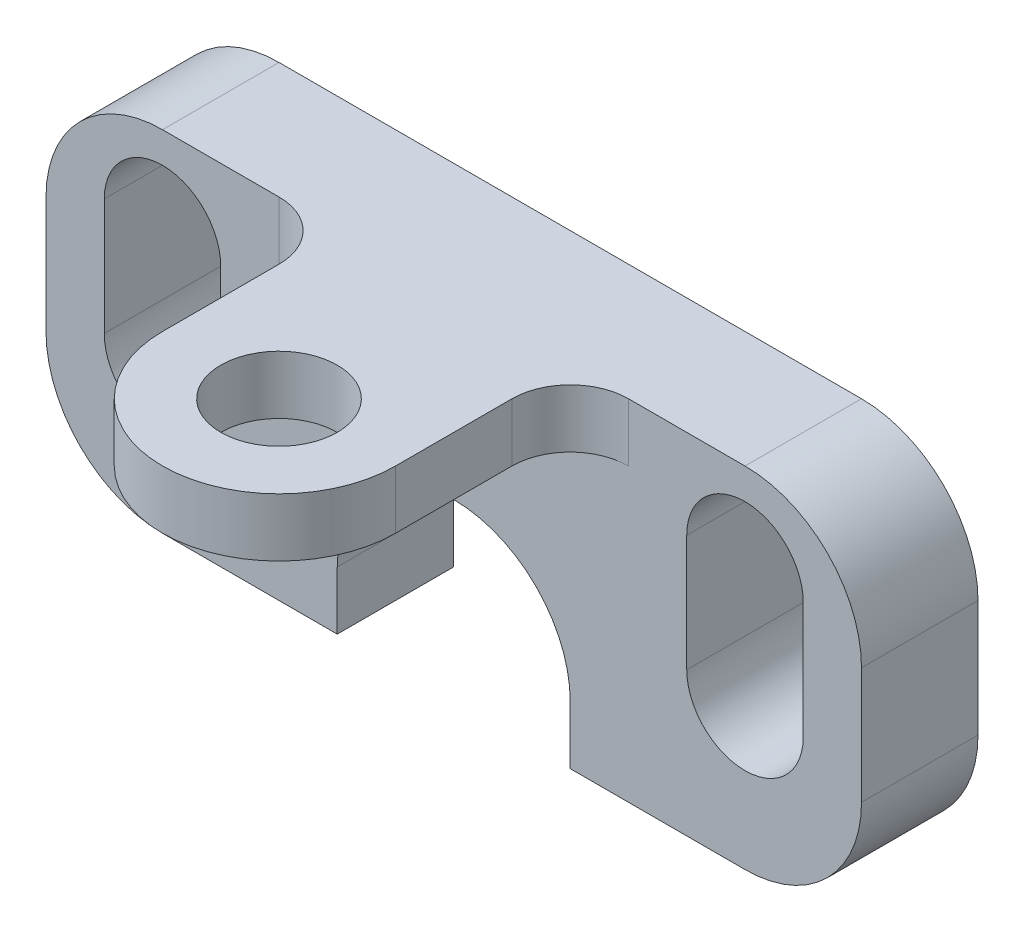
ISO-10303-21;
HEADER;
FILE_DESCRIPTION(('STEP AP214'),'2;1');
FILE_NAME('part.step','',(''),(''),'','','');
FILE_SCHEMA(('AUTOMOTIVE_DESIGN { 1 0 10303 214 1 1 1 1 }'));
ENDSEC;
DATA;
#1=APPLICATION_CONTEXT('core data for automotive mechanical design processes');
#2=APPLICATION_PROTOCOL_DEFINITION('international standard','automotive_design',2000,#1);
#3=PRODUCT_CONTEXT('',#1,'mechanical');
#4=PRODUCT('Part','Part','',(#3));
#5=PRODUCT_RELATED_PRODUCT_CATEGORY('part','',(#4));
#6=PRODUCT_DEFINITION_FORMATION('','',#4);
#7=PRODUCT_DEFINITION_CONTEXT('part definition',#1,'design');
#8=PRODUCT_DEFINITION('design','',#6,#7);
#9=PRODUCT_DEFINITION_SHAPE('','',#8);
#10=(LENGTH_UNIT() NAMED_UNIT(*) SI_UNIT(.MILLI.,.METRE.));
#11=(NAMED_UNIT(*) PLANE_ANGLE_UNIT() SI_UNIT($,.RADIAN.));
#12=(NAMED_UNIT(*) SI_UNIT($,.STERADIAN.) SOLID_ANGLE_UNIT());
#13=UNCERTAINTY_MEASURE_WITH_UNIT(LENGTH_MEASURE(1.E-05),#10,'distance_accuracy_value','');
#14=(GEOMETRIC_REPRESENTATION_CONTEXT(3) GLOBAL_UNCERTAINTY_ASSIGNED_CONTEXT((#13)) GLOBAL_UNIT_ASSIGNED_CONTEXT((#10,
#11,#12)) REPRESENTATION_CONTEXT('',''));
#15=CARTESIAN_POINT('',(0.,0.,0.));
#16=DIRECTION('',(0.,0.,1.));
#17=DIRECTION('',(1.,0.,0.));
#18=AXIS2_PLACEMENT_3D('',#15,#16,#17);
#19=CARTESIAN_POINT('',(0.,-10.,10.));
#20=DIRECTION('',(0.,0.,1.));
#21=DIRECTION('',(1.,0.,0.));
#22=AXIS2_PLACEMENT_3D('',#19,#20,#21);
#23=PLANE('',#22);
#24=DIRECTION('',(-1.,0.,0.));
#25=VECTOR('',#24,1.);
#26=CARTESIAN_POINT('',(-24.9999999999999,15.,10.));
#27=LINE('',#26,#25);
#28=CARTESIAN_POINT('',(24.9999999999999,15.,10.));
#29=VERTEX_POINT('',#28);
#30=CARTESIAN_POINT('',(14.9999999999999,15.,10.));
#31=VERTEX_POINT('',#30);
#32=EDGE_CURVE('E328',#29,#31,#27,.T.);
#33=ORIENTED_EDGE('',*,*,#32,.T.);
#34=DIRECTION('',(0.,1.,0.));
#35=VECTOR('',#34,1.);
#36=CARTESIAN_POINT('',(14.9999999999999,-10.,10.));
#37=LINE('',#36,#35);
#38=CARTESIAN_POINT('',(14.9999999999999,10.,10.));
#39=VERTEX_POINT('',#38);
#40=EDGE_CURVE('E405',#31,#39,#37,.F.);
#41=ORIENTED_EDGE('',*,*,#40,.T.);
#42=DIRECTION('',(1.,0.,0.));
#43=VECTOR('',#42,1.);
#44=CARTESIAN_POINT('',(9.99999999999993,10.,10.));
#45=LINE('',#44,#43);
#46=CARTESIAN_POINT('',(-15.0000000000001,10.,10.));
#47=VERTEX_POINT('',#46);
#48=EDGE_CURVE('E47',#47,#39,#45,.T.);
#49=ORIENTED_EDGE('',*,*,#48,.F.);
#50=DIRECTION('',(0.,-1.,0.));
#51=VECTOR('',#50,1.);
#52=CARTESIAN_POINT('',(-15.0000000000001,-10.,10.));
#53=LINE('',#52,#51);
#54=CARTESIAN_POINT('',(-15.0000000000001,15.,10.));
#55=VERTEX_POINT('',#54);
#56=EDGE_CURVE('E397',#47,#55,#53,.F.);
#57=ORIENTED_EDGE('',*,*,#56,.T.);
#58=CARTESIAN_POINT('',(-24.9999999999999,15.,10.));
#59=VERTEX_POINT('',#58);
#60=EDGE_CURVE('E327',#55,#59,#27,.T.);
#61=ORIENTED_EDGE('',*,*,#60,.T.);
#62=CARTESIAN_POINT('',(-25.,5.,10.));
#63=DIRECTION('',(0.,0.,1.));
#64=DIRECTION('',(1.,0.,0.));
#65=AXIS2_PLACEMENT_3D('',#62,#63,#64);
#66=CIRCLE('',#65,10.);
#67=CARTESIAN_POINT('',(-35.,4.99999999999993,10.));
#68=VERTEX_POINT('',#67);
#69=EDGE_CURVE('E330',#59,#68,#66,.T.);
#70=ORIENTED_EDGE('',*,*,#69,.T.);
#71=DIRECTION('',(0.,-1.,0.));
#72=VECTOR('',#71,1.);
#73=CARTESIAN_POINT('',(-35.,-4.99999999999993,10.));
#74=LINE('',#73,#72);
#75=CARTESIAN_POINT('',(-35.,-4.99999999999993,10.));
#76=VERTEX_POINT('',#75);
#77=EDGE_CURVE('E332',#68,#76,#74,.T.);
#78=ORIENTED_EDGE('',*,*,#77,.T.);
#79=CARTESIAN_POINT('',(-25.,-5.,10.));
#80=DIRECTION('',(0.,0.,1.));
#81=DIRECTION('',(-1.,0.,0.));
#82=AXIS2_PLACEMENT_3D('',#79,#80,#81);
#83=CIRCLE('',#82,10.);
#84=CARTESIAN_POINT('',(-24.9999999999999,-15.,10.));
#85=VERTEX_POINT('',#84);
#86=EDGE_CURVE('E334',#76,#85,#83,.T.);
#87=ORIENTED_EDGE('',*,*,#86,.T.);
#88=DIRECTION('',(1.,0.,0.));
#89=VECTOR('',#88,1.);
#90=CARTESIAN_POINT('',(-24.9999999999999,-15.,10.));
#91=LINE('',#90,#89);
#92=CARTESIAN_POINT('',(-10.,-15.,10.));
#93=VERTEX_POINT('',#92);
#94=EDGE_CURVE('E309',#85,#93,#91,.T.);
#95=ORIENTED_EDGE('',*,*,#94,.T.);
#96=DIRECTION('',(0.,1.,0.));
#97=VECTOR('',#96,1.);
#98=CARTESIAN_POINT('',(-10.,-15.,10.));
#99=LINE('',#98,#97);
#100=CARTESIAN_POINT('',(-10.,-10.,10.));
#101=VERTEX_POINT('',#100);
#102=EDGE_CURVE('E312',#93,#101,#99,.T.);
#103=ORIENTED_EDGE('',*,*,#102,.T.);
#104=CARTESIAN_POINT('',(0.,-10.,10.));
#105=DIRECTION('',(0.,0.,-1.));
#106=DIRECTION('',(1.,0.,0.));
#107=AXIS2_PLACEMENT_3D('',#104,#105,#106);
#108=CIRCLE('',#107,10.);
#109=CARTESIAN_POINT('',(10.,-10.,10.));
#110=VERTEX_POINT('',#109);
#111=EDGE_CURVE('E315',#101,#110,#108,.T.);
#112=ORIENTED_EDGE('',*,*,#111,.T.);
#113=DIRECTION('',(0.,-1.,0.));
#114=VECTOR('',#113,1.);
#115=CARTESIAN_POINT('',(10.,-15.,10.));
#116=LINE('',#115,#114);
#117=CARTESIAN_POINT('',(10.,-15.,10.));
#118=VERTEX_POINT('',#117);
#119=EDGE_CURVE('E317',#110,#118,#116,.T.);
#120=ORIENTED_EDGE('',*,*,#119,.T.);
#121=DIRECTION('',(1.,0.,0.));
#122=VECTOR('',#121,1.);
#123=CARTESIAN_POINT('',(10.,-15.,10.));
#124=LINE('',#123,#122);
#125=CARTESIAN_POINT('',(24.9999999999999,-15.,10.));
#126=VERTEX_POINT('',#125);
#127=EDGE_CURVE('E319',#118,#126,#124,.T.);
#128=ORIENTED_EDGE('',*,*,#127,.T.);
#129=CARTESIAN_POINT('',(25.,-5.,10.));
#130=DIRECTION('',(0.,0.,1.));
#131=DIRECTION('',(1.,0.,0.));
#132=AXIS2_PLACEMENT_3D('',#129,#130,#131);
#133=CIRCLE('',#132,10.);
#134=CARTESIAN_POINT('',(35.,-5.,10.));
#135=VERTEX_POINT('',#134);
#136=EDGE_CURVE('E321',#126,#135,#133,.T.);
#137=ORIENTED_EDGE('',*,*,#136,.T.);
#138=DIRECTION('',(0.,1.,0.));
#139=VECTOR('',#138,1.);
#140=CARTESIAN_POINT('',(35.,-4.99999999999993,10.));
#141=LINE('',#140,#139);
#142=CARTESIAN_POINT('',(35.,4.99999999999993,10.));
#143=VERTEX_POINT('',#142);
#144=EDGE_CURVE('E323',#135,#143,#141,.T.);
#145=ORIENTED_EDGE('',*,*,#144,.T.);
#146=CARTESIAN_POINT('',(25.,5.,10.));
#147=DIRECTION('',(0.,0.,1.));
#148=DIRECTION('',(1.,0.,0.));
#149=AXIS2_PLACEMENT_3D('',#146,#147,#148);
#150=CIRCLE('',#149,10.);
#151=EDGE_CURVE('E325',#143,#29,#150,.T.);
#152=ORIENTED_EDGE('',*,*,#151,.T.);
#153=EDGE_LOOP('',(#33,#41,#49,#57,#61,#70,#78,#87,#95,#103,#112,#120,#128,#137,#145,#152));
#154=FACE_BOUND('',#153,.T.);
#155=DIRECTION('',(0.,-1.,0.));
#156=VECTOR('',#155,1.);
#157=CARTESIAN_POINT('',(20.,7.35416728261833,10.));
#158=LINE('',#157,#156);
#159=CARTESIAN_POINT('',(20.,7.35416728261833,10.));
#160=VERTEX_POINT('',#159);
#161=CARTESIAN_POINT('',(20.,-2.64583271738167,10.));
#162=VERTEX_POINT('',#161);
#163=EDGE_CURVE('E280',#160,#162,#158,.T.);
#164=ORIENTED_EDGE('',*,*,#163,.F.);
#165=CARTESIAN_POINT('',(25.,7.35416728261833,10.));
#166=DIRECTION('',(0.,0.,1.));
#167=DIRECTION('',(1.,0.,0.));
#168=AXIS2_PLACEMENT_3D('',#165,#166,#167);
#169=CIRCLE('',#168,5.);
#170=CARTESIAN_POINT('',(30.,7.35416728261834,10.));
#171=VERTEX_POINT('',#170);
#172=EDGE_CURVE('E278',#171,#160,#169,.T.);
#173=ORIENTED_EDGE('',*,*,#172,.F.);
#174=DIRECTION('',(0.,1.,0.));
#175=VECTOR('',#174,1.);
#176=CARTESIAN_POINT('',(30.,7.35416728261834,10.));
#177=LINE('',#176,#175);
#178=CARTESIAN_POINT('',(30.,-2.64583271738167,10.));
#179=VERTEX_POINT('',#178);
#180=EDGE_CURVE('E286',#179,#171,#177,.T.);
#181=ORIENTED_EDGE('',*,*,#180,.F.);
#182=CARTESIAN_POINT('',(25.,-2.64583271738167,10.));
#183=DIRECTION('',(0.,0.,1.));
#184=DIRECTION('',(1.,0.,0.));
#185=AXIS2_PLACEMENT_3D('',#182,#183,#184);
#186=CIRCLE('',#185,5.);
#187=EDGE_CURVE('E283',#162,#179,#186,.T.);
#188=ORIENTED_EDGE('',*,*,#187,.F.);
#189=EDGE_LOOP('',(#164,#173,#181,#188));
#190=FACE_BOUND('',#189,.T.);
#191=DIRECTION('',(0.,-1.,0.));
#192=VECTOR('',#191,1.);
#193=CARTESIAN_POINT('',(-30.,7.35416728261831,10.));
#194=LINE('',#193,#192);
#195=CARTESIAN_POINT('',(-30.,7.35416728261831,10.));
#196=VERTEX_POINT('',#195);
#197=CARTESIAN_POINT('',(-30.,-2.64583271738169,10.));
#198=VERTEX_POINT('',#197);
#199=EDGE_CURVE('E249',#196,#198,#194,.T.);
#200=ORIENTED_EDGE('',*,*,#199,.F.);
#201=CARTESIAN_POINT('',(-25.,7.35416728261831,10.));
#202=DIRECTION('',(0.,0.,1.));
#203=DIRECTION('',(1.,0.,0.));
#204=AXIS2_PLACEMENT_3D('',#201,#202,#203);
#205=CIRCLE('',#204,5.);
#206=CARTESIAN_POINT('',(-20.,7.35416728261831,10.));
#207=VERTEX_POINT('',#206);
#208=EDGE_CURVE('E247',#207,#196,#205,.T.);
#209=ORIENTED_EDGE('',*,*,#208,.F.);
#210=DIRECTION('',(0.,1.,0.));
#211=VECTOR('',#210,1.);
#212=CARTESIAN_POINT('',(-20.,7.35416728261831,10.));
#213=LINE('',#212,#211);
#214=CARTESIAN_POINT('',(-20.,-2.64583271738169,10.));
#215=VERTEX_POINT('',#214);
#216=EDGE_CURVE('E255',#215,#207,#213,.T.);
#217=ORIENTED_EDGE('',*,*,#216,.F.);
#218=CARTESIAN_POINT('',(-25.,-2.64583271738169,10.));
#219=DIRECTION('',(0.,0.,1.));
#220=DIRECTION('',(1.,0.,0.));
#221=AXIS2_PLACEMENT_3D('',#218,#219,#220);
#222=CIRCLE('',#221,5.);
#223=EDGE_CURVE('E252',#198,#215,#222,.T.);
#224=ORIENTED_EDGE('',*,*,#223,.F.);
#225=EDGE_LOOP('',(#200,#209,#217,#224));
#226=FACE_BOUND('',#225,.T.);
#227=ADVANCED_FACE('F33',(#154,#190,#226),#23,.T.);
#228=CARTESIAN_POINT('',(0.,-10.,0.));
#229=DIRECTION('',(0.,0.,1.));
#230=DIRECTION('',(1.,0.,0.));
#231=AXIS2_PLACEMENT_3D('',#228,#229,#230);
#232=PLANE('',#231);
#233=CARTESIAN_POINT('',(25.,7.35416728261833,0.));
#234=DIRECTION('',(0.,0.,1.));
#235=DIRECTION('',(1.,0.,0.));
#236=AXIS2_PLACEMENT_3D('',#233,#234,#235);
#237=CIRCLE('',#236,5.);
#238=CARTESIAN_POINT('',(30.,7.35416728261833,0.));
#239=VERTEX_POINT('',#238);
#240=CARTESIAN_POINT('',(20.,7.35416728261833,0.));
#241=VERTEX_POINT('',#240);
#242=EDGE_CURVE('E277',#239,#241,#237,.T.);
#243=ORIENTED_EDGE('',*,*,#242,.T.);
#244=DIRECTION('',(0.,-1.,0.));
#245=VECTOR('',#244,1.);
#246=CARTESIAN_POINT('',(20.,7.35416728261833,0.));
#247=LINE('',#246,#245);
#248=CARTESIAN_POINT('',(20.,-2.64583271738167,0.));
#249=VERTEX_POINT('',#248);
#250=EDGE_CURVE('E291',#241,#249,#247,.T.);
#251=ORIENTED_EDGE('',*,*,#250,.T.);
#252=CARTESIAN_POINT('',(25.,-2.64583271738167,0.));
#253=DIRECTION('',(0.,0.,1.));
#254=DIRECTION('',(1.,0.,0.));
#255=AXIS2_PLACEMENT_3D('',#252,#253,#254);
#256=CIRCLE('',#255,5.);
#257=CARTESIAN_POINT('',(30.,-2.64583271738167,0.));
#258=VERTEX_POINT('',#257);
#259=EDGE_CURVE('E294',#249,#258,#256,.T.);
#260=ORIENTED_EDGE('',*,*,#259,.T.);
#261=DIRECTION('',(0.,1.,0.));
#262=VECTOR('',#261,1.);
#263=CARTESIAN_POINT('',(30.,7.35416728261834,0.));
#264=LINE('',#263,#262);
#265=EDGE_CURVE('E281',#258,#239,#264,.T.);
#266=ORIENTED_EDGE('',*,*,#265,.T.);
#267=EDGE_LOOP('',(#243,#251,#260,#266));
#268=FACE_BOUND('',#267,.T.);
#269=DIRECTION('',(1.,0.,0.));
#270=VECTOR('',#269,1.);
#271=CARTESIAN_POINT('',(-24.9999999999999,-15.,0.));
#272=LINE('',#271,#270);
#273=CARTESIAN_POINT('',(-24.9999999999999,-15.,0.));
#274=VERTEX_POINT('',#273);
#275=CARTESIAN_POINT('',(-10.,-15.,0.));
#276=VERTEX_POINT('',#275);
#277=EDGE_CURVE('E308',#274,#276,#272,.T.);
#278=ORIENTED_EDGE('',*,*,#277,.F.);
#279=CARTESIAN_POINT('',(-25.,-5.,0.));
#280=DIRECTION('',(0.,0.,1.));
#281=DIRECTION('',(-1.,0.,0.));
#282=AXIS2_PLACEMENT_3D('',#279,#280,#281);
#283=CIRCLE('',#282,10.);
#284=CARTESIAN_POINT('',(-35.,-4.99999999999993,0.));
#285=VERTEX_POINT('',#284);
#286=EDGE_CURVE('E313',#285,#274,#283,.T.);
#287=ORIENTED_EDGE('',*,*,#286,.F.);
#288=DIRECTION('',(0.,-1.,0.));
#289=VECTOR('',#288,1.);
#290=CARTESIAN_POINT('',(-35.,-4.99999999999993,0.));
#291=LINE('',#290,#289);
#292=CARTESIAN_POINT('',(-35.,4.99999999999993,0.));
#293=VERTEX_POINT('',#292);
#294=EDGE_CURVE('E357',#293,#285,#291,.T.);
#295=ORIENTED_EDGE('',*,*,#294,.F.);
#296=CARTESIAN_POINT('',(-25.,5.,0.));
#297=DIRECTION('',(0.,0.,1.));
#298=DIRECTION('',(1.,0.,0.));
#299=AXIS2_PLACEMENT_3D('',#296,#297,#298);
#300=CIRCLE('',#299,10.);
#301=CARTESIAN_POINT('',(-24.9999999999999,15.,0.));
#302=VERTEX_POINT('',#301);
#303=EDGE_CURVE('E355',#302,#293,#300,.T.);
#304=ORIENTED_EDGE('',*,*,#303,.F.);
#305=DIRECTION('',(-1.,0.,0.));
#306=VECTOR('',#305,1.);
#307=CARTESIAN_POINT('',(-24.9999999999999,15.,0.));
#308=LINE('',#307,#306);
#309=CARTESIAN_POINT('',(24.9999999999999,15.,0.));
#310=VERTEX_POINT('',#309);
#311=EDGE_CURVE('E353',#310,#302,#308,.T.);
#312=ORIENTED_EDGE('',*,*,#311,.F.);
#313=CARTESIAN_POINT('',(25.,5.,0.));
#314=DIRECTION('',(0.,0.,1.));
#315=DIRECTION('',(1.,0.,0.));
#316=AXIS2_PLACEMENT_3D('',#313,#314,#315);
#317=CIRCLE('',#316,10.);
#318=CARTESIAN_POINT('',(35.,4.99999999999993,0.));
#319=VERTEX_POINT('',#318);
#320=EDGE_CURVE('E351',#319,#310,#317,.T.);
#321=ORIENTED_EDGE('',*,*,#320,.F.);
#322=DIRECTION('',(0.,1.,0.));
#323=VECTOR('',#322,1.);
#324=CARTESIAN_POINT('',(35.,-4.99999999999993,0.));
#325=LINE('',#324,#323);
#326=CARTESIAN_POINT('',(35.,-5.,0.));
#327=VERTEX_POINT('',#326);
#328=EDGE_CURVE('E349',#327,#319,#325,.T.);
#329=ORIENTED_EDGE('',*,*,#328,.F.);
#330=CARTESIAN_POINT('',(25.,-5.,0.));
#331=DIRECTION('',(0.,0.,1.));
#332=DIRECTION('',(1.,0.,0.));
#333=AXIS2_PLACEMENT_3D('',#330,#331,#332);
#334=CIRCLE('',#333,10.);
#335=CARTESIAN_POINT('',(24.9999999999999,-15.,0.));
#336=VERTEX_POINT('',#335);
#337=EDGE_CURVE('E347',#336,#327,#334,.T.);
#338=ORIENTED_EDGE('',*,*,#337,.F.);
#339=DIRECTION('',(1.,0.,0.));
#340=VECTOR('',#339,1.);
#341=CARTESIAN_POINT('',(10.,-15.,0.));
#342=LINE('',#341,#340);
#343=CARTESIAN_POINT('',(10.,-15.,0.));
#344=VERTEX_POINT('',#343);
#345=EDGE_CURVE('E345',#344,#336,#342,.T.);
#346=ORIENTED_EDGE('',*,*,#345,.F.);
#347=DIRECTION('',(0.,-1.,0.));
#348=VECTOR('',#347,1.);
#349=CARTESIAN_POINT('',(10.,-15.,0.));
#350=LINE('',#349,#348);
#351=CARTESIAN_POINT('',(10.,-10.,0.));
#352=VERTEX_POINT('',#351);
#353=EDGE_CURVE('E343',#352,#344,#350,.T.);
#354=ORIENTED_EDGE('',*,*,#353,.F.);
#355=CARTESIAN_POINT('',(0.,-10.,0.));
#356=DIRECTION('',(0.,0.,-1.));
#357=DIRECTION('',(1.,0.,0.));
#358=AXIS2_PLACEMENT_3D('',#355,#356,#357);
#359=CIRCLE('',#358,10.);
#360=CARTESIAN_POINT('',(-10.,-10.,0.));
#361=VERTEX_POINT('',#360);
#362=EDGE_CURVE('E341',#361,#352,#359,.T.);
#363=ORIENTED_EDGE('',*,*,#362,.F.);
#364=DIRECTION('',(0.,1.,0.));
#365=VECTOR('',#364,1.);
#366=CARTESIAN_POINT('',(-10.,-15.,0.));
#367=LINE('',#366,#365);
#368=EDGE_CURVE('E339',#276,#361,#367,.T.);
#369=ORIENTED_EDGE('',*,*,#368,.F.);
#370=EDGE_LOOP('',(#278,#287,#295,#304,#312,#321,#329,#338,#346,#354,#363,#369));
#371=FACE_BOUND('',#370,.T.);
#372=CARTESIAN_POINT('',(-25.,7.35416728261831,0.));
#373=DIRECTION('',(0.,0.,1.));
#374=DIRECTION('',(1.,0.,0.));
#375=AXIS2_PLACEMENT_3D('',#372,#373,#374);
#376=CIRCLE('',#375,5.);
#377=CARTESIAN_POINT('',(-20.,7.35416728261831,0.));
#378=VERTEX_POINT('',#377);
#379=CARTESIAN_POINT('',(-30.,7.35416728261831,0.));
#380=VERTEX_POINT('',#379);
#381=EDGE_CURVE('E246',#378,#380,#376,.T.);
#382=ORIENTED_EDGE('',*,*,#381,.T.);
#383=DIRECTION('',(0.,-1.,0.));
#384=VECTOR('',#383,1.);
#385=CARTESIAN_POINT('',(-30.,7.35416728261831,0.));
#386=LINE('',#385,#384);
#387=CARTESIAN_POINT('',(-30.,-2.64583271738169,0.));
#388=VERTEX_POINT('',#387);
#389=EDGE_CURVE('E260',#380,#388,#386,.T.);
#390=ORIENTED_EDGE('',*,*,#389,.T.);
#391=CARTESIAN_POINT('',(-25.,-2.64583271738169,0.));
#392=DIRECTION('',(0.,0.,1.));
#393=DIRECTION('',(1.,0.,0.));
#394=AXIS2_PLACEMENT_3D('',#391,#392,#393);
#395=CIRCLE('',#394,5.);
#396=CARTESIAN_POINT('',(-20.,-2.64583271738169,0.));
#397=VERTEX_POINT('',#396);
#398=EDGE_CURVE('E263',#388,#397,#395,.T.);
#399=ORIENTED_EDGE('',*,*,#398,.T.);
#400=DIRECTION('',(0.,1.,0.));
#401=VECTOR('',#400,1.);
#402=CARTESIAN_POINT('',(-20.,7.35416728261831,0.));
#403=LINE('',#402,#401);
#404=EDGE_CURVE('E250',#397,#378,#403,.T.);
#405=ORIENTED_EDGE('',*,*,#404,.T.);
#406=EDGE_LOOP('',(#382,#390,#399,#405));
#407=FACE_BOUND('',#406,.T.);
#408=ADVANCED_FACE('F474',(#268,#371,#407),#232,.F.);
#409=CARTESIAN_POINT('',(-24.9999999999999,-15.,10.));
#410=DIRECTION('',(0.,1.,0.));
#411=DIRECTION('',(0.,0.,1.));
#412=AXIS2_PLACEMENT_3D('',#409,#410,#411);
#413=PLANE('',#412);
#414=ORIENTED_EDGE('',*,*,#277,.T.);
#415=DIRECTION('',(0.,0.,-1.));
#416=VECTOR('',#415,1.);
#417=CARTESIAN_POINT('',(-10.,-15.,10.));
#418=LINE('',#417,#416);
#419=EDGE_CURVE('E392',#93,#276,#418,.T.);
#420=ORIENTED_EDGE('',*,*,#419,.F.);
#421=ORIENTED_EDGE('',*,*,#94,.F.);
#422=DIRECTION('',(0.,0.,-1.));
#423=VECTOR('',#422,1.);
#424=CARTESIAN_POINT('',(-24.9999999999999,-15.,10.));
#425=LINE('',#424,#423);
#426=EDGE_CURVE('E336',#85,#274,#425,.T.);
#427=ORIENTED_EDGE('',*,*,#426,.T.);
#428=EDGE_LOOP('',(#414,#420,#421,#427));
#429=FACE_BOUND('',#428,.T.);
#430=ADVANCED_FACE('F439',(#429),#413,.F.);
#431=CARTESIAN_POINT('',(-10.,-15.,10.));
#432=DIRECTION('',(-1.,0.,0.));
#433=DIRECTION('',(0.,0.,1.));
#434=AXIS2_PLACEMENT_3D('',#431,#432,#433);
#435=PLANE('',#434);
#436=ORIENTED_EDGE('',*,*,#368,.T.);
#437=DIRECTION('',(0.,0.,-1.));
#438=VECTOR('',#437,1.);
#439=CARTESIAN_POINT('',(-10.,-10.,10.));
#440=LINE('',#439,#438);
#441=EDGE_CURVE('E389',#101,#361,#440,.T.);
#442=ORIENTED_EDGE('',*,*,#441,.F.);
#443=ORIENTED_EDGE('',*,*,#102,.F.);
#444=ORIENTED_EDGE('',*,*,#419,.T.);
#445=EDGE_LOOP('',(#436,#442,#443,#444));
#446=FACE_BOUND('',#445,.T.);
#447=ADVANCED_FACE('F444',(#446),#435,.F.);
#448=CARTESIAN_POINT('',(0.,-10.,10.));
#449=DIRECTION('',(0.,0.,-1.));
#450=DIRECTION('',(-1.,0.,0.));
#451=AXIS2_PLACEMENT_3D('',#448,#449,#450);
#452=CYLINDRICAL_SURFACE('',#451,10.);
#453=ORIENTED_EDGE('',*,*,#362,.T.);
#454=DIRECTION('',(0.,0.,-1.));
#455=VECTOR('',#454,1.);
#456=CARTESIAN_POINT('',(10.,-10.,10.));
#457=LINE('',#456,#455);
#458=EDGE_CURVE('E386',#110,#352,#457,.T.);
#459=ORIENTED_EDGE('',*,*,#458,.F.);
#460=ORIENTED_EDGE('',*,*,#111,.F.);
#461=ORIENTED_EDGE('',*,*,#441,.T.);
#462=EDGE_LOOP('',(#453,#459,#460,#461));
#463=FACE_BOUND('',#462,.T.);
#464=ADVANCED_FACE('F447',(#463),#452,.F.);
#465=CARTESIAN_POINT('',(10.,-15.,10.));
#466=DIRECTION('',(1.,0.,0.));
#467=DIRECTION('',(0.,0.,-1.));
#468=AXIS2_PLACEMENT_3D('',#465,#466,#467);
#469=PLANE('',#468);
#470=ORIENTED_EDGE('',*,*,#353,.T.);
#471=DIRECTION('',(0.,0.,-1.));
#472=VECTOR('',#471,1.);
#473=CARTESIAN_POINT('',(10.,-15.,10.));
#474=LINE('',#473,#472);
#475=EDGE_CURVE('E383',#118,#344,#474,.T.);
#476=ORIENTED_EDGE('',*,*,#475,.F.);
#477=ORIENTED_EDGE('',*,*,#119,.F.);
#478=ORIENTED_EDGE('',*,*,#458,.T.);
#479=EDGE_LOOP('',(#470,#476,#477,#478));
#480=FACE_BOUND('',#479,.T.);
#481=ADVANCED_FACE('F452',(#480),#469,.F.);
#482=CARTESIAN_POINT('',(10.,-15.,10.));
#483=DIRECTION('',(0.,1.,0.));
#484=DIRECTION('',(0.,0.,1.));
#485=AXIS2_PLACEMENT_3D('',#482,#483,#484);
#486=PLANE('',#485);
#487=ORIENTED_EDGE('',*,*,#345,.T.);
#488=DIRECTION('',(0.,0.,-1.));
#489=VECTOR('',#488,1.);
#490=CARTESIAN_POINT('',(24.9999999999999,-15.,10.));
#491=LINE('',#490,#489);
#492=EDGE_CURVE('E380',#126,#336,#491,.T.);
#493=ORIENTED_EDGE('',*,*,#492,.F.);
#494=ORIENTED_EDGE('',*,*,#127,.F.);
#495=ORIENTED_EDGE('',*,*,#475,.T.);
#496=EDGE_LOOP('',(#487,#493,#494,#495));
#497=FACE_BOUND('',#496,.T.);
#498=ADVANCED_FACE('F458',(#497),#486,.F.);
#499=CARTESIAN_POINT('',(25.,-5.,10.));
#500=DIRECTION('',(0.,0.,-1.));
#501=DIRECTION('',(-1.,0.,0.));
#502=AXIS2_PLACEMENT_3D('',#499,#500,#501);
#503=CYLINDRICAL_SURFACE('',#502,10.);
#504=ORIENTED_EDGE('',*,*,#337,.T.);
#505=DIRECTION('',(0.,0.,-1.));
#506=VECTOR('',#505,1.);
#507=CARTESIAN_POINT('',(35.,-5.,10.));
#508=LINE('',#507,#506);
#509=EDGE_CURVE('E377',#135,#327,#508,.T.);
#510=ORIENTED_EDGE('',*,*,#509,.F.);
#511=ORIENTED_EDGE('',*,*,#136,.F.);
#512=ORIENTED_EDGE('',*,*,#492,.T.);
#513=EDGE_LOOP('',(#504,#510,#511,#512));
#514=FACE_BOUND('',#513,.T.);
#515=ADVANCED_FACE('F462',(#514),#503,.T.);
#516=CARTESIAN_POINT('',(35.,-4.99999999999993,10.));
#517=DIRECTION('',(-1.,0.,0.));
#518=DIRECTION('',(0.,0.,1.));
#519=AXIS2_PLACEMENT_3D('',#516,#517,#518);
#520=PLANE('',#519);
#521=ORIENTED_EDGE('',*,*,#328,.T.);
#522=DIRECTION('',(0.,0.,-1.));
#523=VECTOR('',#522,1.);
#524=CARTESIAN_POINT('',(35.,4.99999999999993,10.));
#525=LINE('',#524,#523);
#526=EDGE_CURVE('E374',#143,#319,#525,.T.);
#527=ORIENTED_EDGE('',*,*,#526,.F.);
#528=ORIENTED_EDGE('',*,*,#144,.F.);
#529=ORIENTED_EDGE('',*,*,#509,.T.);
#530=EDGE_LOOP('',(#521,#527,#528,#529));
#531=FACE_BOUND('',#530,.T.);
#532=ADVANCED_FACE('F467',(#531),#520,.F.);
#533=CARTESIAN_POINT('',(25.,5.,10.));
#534=DIRECTION('',(0.,0.,-1.));
#535=DIRECTION('',(-1.,0.,0.));
#536=AXIS2_PLACEMENT_3D('',#533,#534,#535);
#537=CYLINDRICAL_SURFACE('',#536,10.);
#538=ORIENTED_EDGE('',*,*,#320,.T.);
#539=DIRECTION('',(0.,0.,-1.));
#540=VECTOR('',#539,1.);
#541=CARTESIAN_POINT('',(24.9999999999999,15.,10.));
#542=LINE('',#541,#540);
#543=EDGE_CURVE('E371',#29,#310,#542,.T.);
#544=ORIENTED_EDGE('',*,*,#543,.F.);
#545=ORIENTED_EDGE('',*,*,#151,.F.);
#546=ORIENTED_EDGE('',*,*,#526,.T.);
#547=EDGE_LOOP('',(#538,#544,#545,#546));
#548=FACE_BOUND('',#547,.T.);
#549=ADVANCED_FACE('F471',(#548),#537,.T.);
#550=CARTESIAN_POINT('',(-24.9999999999999,15.,10.));
#551=DIRECTION('',(0.,-1.,0.));
#552=DIRECTION('',(0.,0.,-1.));
#553=AXIS2_PLACEMENT_3D('',#550,#551,#552);
#554=PLANE('',#553);
#555=CARTESIAN_POINT('',(0.,15.,25.));
#556=DIRECTION('',(0.,1.,0.));
#557=DIRECTION('',(0.,0.,1.));
#558=AXIS2_PLACEMENT_3D('',#555,#556,#557);
#559=CIRCLE('',#558,5.);
#560=CARTESIAN_POINT('',(0.,15.,30.));
#561=VERTEX_POINT('',#560);
#562=EDGE_CURVE('E236',#561,#561,#559,.T.);
#563=ORIENTED_EDGE('',*,*,#562,.F.);
#564=EDGE_LOOP('',(#563));
#565=FACE_BOUND('',#564,.T.);
#566=ORIENTED_EDGE('',*,*,#311,.T.);
#567=DIRECTION('',(0.,0.,-1.));
#568=VECTOR('',#567,1.);
#569=CARTESIAN_POINT('',(-24.9999999999999,15.,10.));
#570=LINE('',#569,#568);
#571=EDGE_CURVE('E368',#59,#302,#570,.T.);
#572=ORIENTED_EDGE('',*,*,#571,.F.);
#573=ORIENTED_EDGE('',*,*,#60,.F.);
#574=CARTESIAN_POINT('',(-15.0000000000001,15.,15.));
#575=DIRECTION('',(0.,-1.,0.));
#576=DIRECTION('',(0.,0.,-1.));
#577=AXIS2_PLACEMENT_3D('',#574,#575,#576);
#578=CIRCLE('',#577,5.);
#579=CARTESIAN_POINT('',(-10.0000000000001,15.,15.));
#580=VERTEX_POINT('',#579);
#581=EDGE_CURVE('E225',#55,#580,#578,.T.);
#582=ORIENTED_EDGE('',*,*,#581,.T.);
#583=DIRECTION('',(0.,0.,-1.));
#584=VECTOR('',#583,1.);
#585=CARTESIAN_POINT('',(-10.0000000000001,15.,25.));
#586=LINE('',#585,#584);
#587=CARTESIAN_POINT('',(-10.0000000000001,15.,25.));
#588=VERTEX_POINT('',#587);
#589=EDGE_CURVE('E209',#588,#580,#586,.T.);
#590=ORIENTED_EDGE('',*,*,#589,.F.);
#591=CARTESIAN_POINT('',(0.,15.,25.));
#592=DIRECTION('',(0.,1.,0.));
#593=DIRECTION('',(0.,0.,1.));
#594=AXIS2_PLACEMENT_3D('',#591,#592,#593);
#595=CIRCLE('',#594,10.);
#596=CARTESIAN_POINT('',(9.99999999999993,15.,25.));
#597=VERTEX_POINT('',#596);
#598=EDGE_CURVE('E222',#588,#597,#595,.T.);
#599=ORIENTED_EDGE('',*,*,#598,.T.);
#600=DIRECTION('',(0.,0.,-1.));
#601=VECTOR('',#600,1.);
#602=CARTESIAN_POINT('',(9.99999999999993,15.,25.));
#603=LINE('',#602,#601);
#604=CARTESIAN_POINT('',(9.99999999999993,15.,15.));
#605=VERTEX_POINT('',#604);
#606=EDGE_CURVE('E226',#597,#605,#603,.T.);
#607=ORIENTED_EDGE('',*,*,#606,.T.);
#608=CARTESIAN_POINT('',(14.9999999999999,15.,15.));
#609=DIRECTION('',(0.,-1.,0.));
#610=DIRECTION('',(0.,0.,-1.));
#611=AXIS2_PLACEMENT_3D('',#608,#609,#610);
#612=CIRCLE('',#611,5.);
#613=EDGE_CURVE('E41',#605,#31,#612,.T.);
#614=ORIENTED_EDGE('',*,*,#613,.T.);
#615=ORIENTED_EDGE('',*,*,#32,.F.);
#616=ORIENTED_EDGE('',*,*,#543,.T.);
#617=EDGE_LOOP('',(#566,#572,#573,#582,#590,#599,#607,#614,#615,#616));
#618=FACE_BOUND('',#617,.T.);
#619=ADVANCED_FACE('F221',(#565,#618),#554,.F.);
#620=CARTESIAN_POINT('',(-25.,5.,10.));
#621=DIRECTION('',(0.,0.,-1.));
#622=DIRECTION('',(-1.,0.,0.));
#623=AXIS2_PLACEMENT_3D('',#620,#621,#622);
#624=CYLINDRICAL_SURFACE('',#623,10.);
#625=ORIENTED_EDGE('',*,*,#303,.T.);
#626=DIRECTION('',(0.,0.,-1.));
#627=VECTOR('',#626,1.);
#628=CARTESIAN_POINT('',(-35.,4.99999999999993,10.));
#629=LINE('',#628,#627);
#630=EDGE_CURVE('E365',#68,#293,#629,.T.);
#631=ORIENTED_EDGE('',*,*,#630,.F.);
#632=ORIENTED_EDGE('',*,*,#69,.F.);
#633=ORIENTED_EDGE('',*,*,#571,.T.);
#634=EDGE_LOOP('',(#625,#631,#632,#633));
#635=FACE_BOUND('',#634,.T.);
#636=ADVANCED_FACE('F424',(#635),#624,.T.);
#637=CARTESIAN_POINT('',(-35.,-4.99999999999993,10.));
#638=DIRECTION('',(1.,0.,0.));
#639=DIRECTION('',(0.,0.,-1.));
#640=AXIS2_PLACEMENT_3D('',#637,#638,#639);
#641=PLANE('',#640);
#642=ORIENTED_EDGE('',*,*,#294,.T.);
#643=DIRECTION('',(0.,0.,-1.));
#644=VECTOR('',#643,1.);
#645=CARTESIAN_POINT('',(-35.,-4.99999999999993,10.));
#646=LINE('',#645,#644);
#647=EDGE_CURVE('E362',#76,#285,#646,.T.);
#648=ORIENTED_EDGE('',*,*,#647,.F.);
#649=ORIENTED_EDGE('',*,*,#77,.F.);
#650=ORIENTED_EDGE('',*,*,#630,.T.);
#651=EDGE_LOOP('',(#642,#648,#649,#650));
#652=FACE_BOUND('',#651,.T.);
#653=ADVANCED_FACE('F430',(#652),#641,.F.);
#654=CARTESIAN_POINT('',(-25.,-5.,10.));
#655=DIRECTION('',(0.,0.,-1.));
#656=DIRECTION('',(-1.,0.,0.));
#657=AXIS2_PLACEMENT_3D('',#654,#655,#656);
#658=CYLINDRICAL_SURFACE('',#657,10.);
#659=ORIENTED_EDGE('',*,*,#286,.T.);
#660=ORIENTED_EDGE('',*,*,#426,.F.);
#661=ORIENTED_EDGE('',*,*,#86,.F.);
#662=ORIENTED_EDGE('',*,*,#647,.T.);
#663=EDGE_LOOP('',(#659,#660,#661,#662));
#664=FACE_BOUND('',#663,.T.);
#665=ADVANCED_FACE('F434',(#664),#658,.T.);
#666=CARTESIAN_POINT('',(25.,7.35416728261833,10.));
#667=DIRECTION('',(0.,0.,-1.));
#668=DIRECTION('',(-1.,0.,0.));
#669=AXIS2_PLACEMENT_3D('',#666,#667,#668);
#670=CYLINDRICAL_SURFACE('',#669,5.);
#671=ORIENTED_EDGE('',*,*,#242,.F.);
#672=DIRECTION('',(0.,0.,-1.));
#673=VECTOR('',#672,1.);
#674=CARTESIAN_POINT('',(30.,7.35416728261834,10.));
#675=LINE('',#674,#673);
#676=EDGE_CURVE('E288',#171,#239,#675,.T.);
#677=ORIENTED_EDGE('',*,*,#676,.F.);
#678=ORIENTED_EDGE('',*,*,#172,.T.);
#679=DIRECTION('',(0.,0.,-1.));
#680=VECTOR('',#679,1.);
#681=CARTESIAN_POINT('',(20.,7.35416728261833,10.));
#682=LINE('',#681,#680);
#683=EDGE_CURVE('E305',#160,#241,#682,.T.);
#684=ORIENTED_EDGE('',*,*,#683,.T.);
#685=EDGE_LOOP('',(#671,#677,#678,#684));
#686=FACE_BOUND('',#685,.T.);
#687=ADVANCED_FACE('F510',(#686),#670,.F.);
#688=CARTESIAN_POINT('',(20.,7.35416728261833,10.));
#689=DIRECTION('',(1.,0.,0.));
#690=DIRECTION('',(0.,1.,0.));
#691=AXIS2_PLACEMENT_3D('',#688,#689,#690);
#692=PLANE('',#691);
#693=ORIENTED_EDGE('',*,*,#250,.F.);
#694=ORIENTED_EDGE('',*,*,#683,.F.);
#695=ORIENTED_EDGE('',*,*,#163,.T.);
#696=DIRECTION('',(0.,0.,-1.));
#697=VECTOR('',#696,1.);
#698=CARTESIAN_POINT('',(20.,-2.64583271738167,10.));
#699=LINE('',#698,#697);
#700=EDGE_CURVE('E303',#162,#249,#699,.T.);
#701=ORIENTED_EDGE('',*,*,#700,.T.);
#702=EDGE_LOOP('',(#693,#694,#695,#701));
#703=FACE_BOUND('',#702,.T.);
#704=ADVANCED_FACE('F684',(#703),#692,.T.);
#705=CARTESIAN_POINT('',(25.,-2.64583271738167,10.));
#706=DIRECTION('',(0.,0.,-1.));
#707=DIRECTION('',(-1.,0.,0.));
#708=AXIS2_PLACEMENT_3D('',#705,#706,#707);
#709=CYLINDRICAL_SURFACE('',#708,5.);
#710=ORIENTED_EDGE('',*,*,#259,.F.);
#711=ORIENTED_EDGE('',*,*,#700,.F.);
#712=ORIENTED_EDGE('',*,*,#187,.T.);
#713=DIRECTION('',(0.,0.,-1.));
#714=VECTOR('',#713,1.);
#715=CARTESIAN_POINT('',(30.,-2.64583271738167,10.));
#716=LINE('',#715,#714);
#717=EDGE_CURVE('E301',#179,#258,#716,.T.);
#718=ORIENTED_EDGE('',*,*,#717,.T.);
#719=EDGE_LOOP('',(#710,#711,#712,#718));
#720=FACE_BOUND('',#719,.T.);
#721=ADVANCED_FACE('F692',(#720),#709,.F.);
#722=CARTESIAN_POINT('',(30.,7.35416728261834,10.));
#723=DIRECTION('',(-1.,0.,0.));
#724=DIRECTION('',(0.,-1.,0.));
#725=AXIS2_PLACEMENT_3D('',#722,#723,#724);
#726=PLANE('',#725);
#727=ORIENTED_EDGE('',*,*,#265,.F.);
#728=ORIENTED_EDGE('',*,*,#717,.F.);
#729=ORIENTED_EDGE('',*,*,#180,.T.);
#730=ORIENTED_EDGE('',*,*,#676,.T.);
#731=EDGE_LOOP('',(#727,#728,#729,#730));
#732=FACE_BOUND('',#731,.T.);
#733=ADVANCED_FACE('F700',(#732),#726,.T.);
#734=CARTESIAN_POINT('',(-25.,7.35416728261831,10.));
#735=DIRECTION('',(0.,0.,-1.));
#736=DIRECTION('',(-1.,0.,0.));
#737=AXIS2_PLACEMENT_3D('',#734,#735,#736);
#738=CYLINDRICAL_SURFACE('',#737,5.);
#739=ORIENTED_EDGE('',*,*,#381,.F.);
#740=DIRECTION('',(0.,0.,-1.));
#741=VECTOR('',#740,1.);
#742=CARTESIAN_POINT('',(-20.,7.35416728261831,10.));
#743=LINE('',#742,#741);
#744=EDGE_CURVE('E257',#207,#378,#743,.T.);
#745=ORIENTED_EDGE('',*,*,#744,.F.);
#746=ORIENTED_EDGE('',*,*,#208,.T.);
#747=DIRECTION('',(0.,0.,-1.));
#748=VECTOR('',#747,1.);
#749=CARTESIAN_POINT('',(-30.,7.35416728261831,10.));
#750=LINE('',#749,#748);
#751=EDGE_CURVE('E274',#196,#380,#750,.T.);
#752=ORIENTED_EDGE('',*,*,#751,.T.);
#753=EDGE_LOOP('',(#739,#745,#746,#752));
#754=FACE_BOUND('',#753,.T.);
#755=ADVANCED_FACE('F482',(#754),#738,.F.);
#756=CARTESIAN_POINT('',(-30.,7.35416728261831,10.));
#757=DIRECTION('',(1.,0.,0.));
#758=DIRECTION('',(0.,1.,0.));
#759=AXIS2_PLACEMENT_3D('',#756,#757,#758);
#760=PLANE('',#759);
#761=ORIENTED_EDGE('',*,*,#389,.F.);
#762=ORIENTED_EDGE('',*,*,#751,.F.);
#763=ORIENTED_EDGE('',*,*,#199,.T.);
#764=DIRECTION('',(0.,0.,-1.));
#765=VECTOR('',#764,1.);
#766=CARTESIAN_POINT('',(-30.,-2.64583271738169,10.));
#767=LINE('',#766,#765);
#768=EDGE_CURVE('E272',#198,#388,#767,.T.);
#769=ORIENTED_EDGE('',*,*,#768,.T.);
#770=EDGE_LOOP('',(#761,#762,#763,#769));
#771=FACE_BOUND('',#770,.T.);
#772=ADVANCED_FACE('F492',(#771),#760,.T.);
#773=CARTESIAN_POINT('',(-25.,-2.64583271738169,10.));
#774=DIRECTION('',(0.,0.,-1.));
#775=DIRECTION('',(-1.,0.,0.));
#776=AXIS2_PLACEMENT_3D('',#773,#774,#775);
#777=CYLINDRICAL_SURFACE('',#776,5.);
#778=ORIENTED_EDGE('',*,*,#398,.F.);
#779=ORIENTED_EDGE('',*,*,#768,.F.);
#780=ORIENTED_EDGE('',*,*,#223,.T.);
#781=DIRECTION('',(0.,0.,-1.));
#782=VECTOR('',#781,1.);
#783=CARTESIAN_POINT('',(-20.,-2.64583271738169,10.));
#784=LINE('',#783,#782);
#785=EDGE_CURVE('E270',#215,#397,#784,.T.);
#786=ORIENTED_EDGE('',*,*,#785,.T.);
#787=EDGE_LOOP('',(#778,#779,#780,#786));
#788=FACE_BOUND('',#787,.T.);
#789=ADVANCED_FACE('F496',(#788),#777,.F.);
#790=CARTESIAN_POINT('',(-20.,7.35416728261831,10.));
#791=DIRECTION('',(-1.,0.,0.));
#792=DIRECTION('',(0.,-1.,0.));
#793=AXIS2_PLACEMENT_3D('',#790,#791,#792);
#794=PLANE('',#793);
#795=ORIENTED_EDGE('',*,*,#404,.F.);
#796=ORIENTED_EDGE('',*,*,#785,.F.);
#797=ORIENTED_EDGE('',*,*,#216,.T.);
#798=ORIENTED_EDGE('',*,*,#744,.T.);
#799=EDGE_LOOP('',(#795,#796,#797,#798));
#800=FACE_BOUND('',#799,.T.);
#801=ADVANCED_FACE('F486',(#800),#794,.T.);
#802=CARTESIAN_POINT('',(9.99999999999993,15.,25.));
#803=DIRECTION('',(-1.,0.,0.));
#804=DIRECTION('',(0.,0.,1.));
#805=AXIS2_PLACEMENT_3D('',#802,#803,#804);
#806=PLANE('',#805);
#807=DIRECTION('',(0.,0.,-1.));
#808=VECTOR('',#807,1.);
#809=CARTESIAN_POINT('',(9.99999999999993,10.,25.));
#810=LINE('',#809,#808);
#811=CARTESIAN_POINT('',(9.99999999999993,10.,25.));
#812=VERTEX_POINT('',#811);
#813=CARTESIAN_POINT('',(9.99999999999993,10.,15.));
#814=VERTEX_POINT('',#813);
#815=EDGE_CURVE('E217',#812,#814,#810,.T.);
#816=ORIENTED_EDGE('',*,*,#815,.T.);
#817=DIRECTION('',(0.,1.,0.));
#818=VECTOR('',#817,1.);
#819=CARTESIAN_POINT('',(9.99999999999993,15.,15.));
#820=LINE('',#819,#818);
#821=EDGE_CURVE('E402',#814,#605,#820,.T.);
#822=ORIENTED_EDGE('',*,*,#821,.T.);
#823=ORIENTED_EDGE('',*,*,#606,.F.);
#824=DIRECTION('',(0.,1.,0.));
#825=VECTOR('',#824,1.);
#826=CARTESIAN_POINT('',(9.99999999999993,15.,25.));
#827=LINE('',#826,#825);
#828=EDGE_CURVE('E218',#812,#597,#827,.T.);
#829=ORIENTED_EDGE('',*,*,#828,.F.);
#830=EDGE_LOOP('',(#816,#822,#823,#829));
#831=FACE_BOUND('',#830,.T.);
#832=ADVANCED_FACE('F414',(#831),#806,.F.);
#833=CARTESIAN_POINT('',(-10.0000000000001,15.,25.));
#834=DIRECTION('',(1.,0.,0.));
#835=DIRECTION('',(0.,0.,-1.));
#836=AXIS2_PLACEMENT_3D('',#833,#834,#835);
#837=PLANE('',#836);
#838=ORIENTED_EDGE('',*,*,#589,.T.);
#839=DIRECTION('',(0.,-1.,0.));
#840=VECTOR('',#839,1.);
#841=CARTESIAN_POINT('',(-10.0000000000001,15.,15.));
#842=LINE('',#841,#840);
#843=CARTESIAN_POINT('',(-10.0000000000001,10.,15.));
#844=VERTEX_POINT('',#843);
#845=EDGE_CURVE('E395',#580,#844,#842,.T.);
#846=ORIENTED_EDGE('',*,*,#845,.T.);
#847=DIRECTION('',(0.,0.,-1.));
#848=VECTOR('',#847,1.);
#849=CARTESIAN_POINT('',(-10.0000000000001,10.,25.));
#850=LINE('',#849,#848);
#851=CARTESIAN_POINT('',(-10.0000000000001,10.,25.));
#852=VERTEX_POINT('',#851);
#853=EDGE_CURVE('E212',#852,#844,#850,.T.);
#854=ORIENTED_EDGE('',*,*,#853,.F.);
#855=DIRECTION('',(0.,-1.,0.));
#856=VECTOR('',#855,1.);
#857=CARTESIAN_POINT('',(-10.0000000000001,15.,25.));
#858=LINE('',#857,#856);
#859=EDGE_CURVE('E205',#588,#852,#858,.T.);
#860=ORIENTED_EDGE('',*,*,#859,.F.);
#861=EDGE_LOOP('',(#838,#846,#854,#860));
#862=FACE_BOUND('',#861,.T.);
#863=ADVANCED_FACE('F207',(#862),#837,.F.);
#864=CARTESIAN_POINT('',(9.99999999999993,10.,25.));
#865=DIRECTION('',(0.,1.,0.));
#866=DIRECTION('',(-1.,0.,0.));
#867=AXIS2_PLACEMENT_3D('',#864,#865,#866);
#868=PLANE('',#867);
#869=CARTESIAN_POINT('',(0.,10.,25.));
#870=DIRECTION('',(0.,1.,0.));
#871=DIRECTION('',(0.,0.,1.));
#872=AXIS2_PLACEMENT_3D('',#869,#870,#871);
#873=CIRCLE('',#872,5.);
#874=CARTESIAN_POINT('',(0.,10.,30.));
#875=VERTEX_POINT('',#874);
#876=EDGE_CURVE('E232',#875,#875,#873,.T.);
#877=ORIENTED_EDGE('',*,*,#876,.T.);
#878=EDGE_LOOP('',(#877));
#879=FACE_BOUND('',#878,.T.);
#880=ORIENTED_EDGE('',*,*,#48,.T.);
#881=CARTESIAN_POINT('',(14.9999999999999,10.,15.));
#882=DIRECTION('',(0.,1.,0.));
#883=DIRECTION('',(-1.,0.,0.));
#884=AXIS2_PLACEMENT_3D('',#881,#882,#883);
#885=CIRCLE('',#884,5.);
#886=EDGE_CURVE('E11',#39,#814,#885,.T.);
#887=ORIENTED_EDGE('',*,*,#886,.T.);
#888=ORIENTED_EDGE('',*,*,#815,.F.);
#889=CARTESIAN_POINT('',(0.,10.,25.));
#890=DIRECTION('',(0.,1.,0.));
#891=DIRECTION('',(0.,0.,1.));
#892=AXIS2_PLACEMENT_3D('',#889,#890,#891);
#893=CIRCLE('',#892,10.);
#894=EDGE_CURVE('E231',#852,#812,#893,.T.);
#895=ORIENTED_EDGE('',*,*,#894,.F.);
#896=ORIENTED_EDGE('',*,*,#853,.T.);
#897=CARTESIAN_POINT('',(-15.0000000000001,10.,15.));
#898=DIRECTION('',(0.,1.,0.));
#899=DIRECTION('',(-1.,0.,0.));
#900=AXIS2_PLACEMENT_3D('',#897,#898,#899);
#901=CIRCLE('',#900,5.);
#902=EDGE_CURVE('E399',#844,#47,#901,.T.);
#903=ORIENTED_EDGE('',*,*,#902,.T.);
#904=EDGE_LOOP('',(#880,#887,#888,#895,#896,#903));
#905=FACE_BOUND('',#904,.T.);
#906=ADVANCED_FACE('F412',(#879,#905),#868,.F.);
#907=CARTESIAN_POINT('',(-15.0000000000001,15.,15.));
#908=DIRECTION('',(0.,-1.,0.));
#909=DIRECTION('',(0.,0.,-1.));
#910=AXIS2_PLACEMENT_3D('',#907,#908,#909);
#911=CYLINDRICAL_SURFACE('',#910,5.);
#912=ORIENTED_EDGE('',*,*,#581,.F.);
#913=ORIENTED_EDGE('',*,*,#56,.F.);
#914=ORIENTED_EDGE('',*,*,#902,.F.);
#915=ORIENTED_EDGE('',*,*,#845,.F.);
#916=EDGE_LOOP('',(#912,#913,#914,#915));
#917=FACE_BOUND('',#916,.T.);
#918=ADVANCED_FACE('F417',(#917),#911,.F.);
#919=CARTESIAN_POINT('',(14.9999999999999,15.,15.));
#920=DIRECTION('',(0.,1.,0.));
#921=DIRECTION('',(0.,0.,1.));
#922=AXIS2_PLACEMENT_3D('',#919,#920,#921);
#923=CYLINDRICAL_SURFACE('',#922,5.);
#924=ORIENTED_EDGE('',*,*,#886,.F.);
#925=ORIENTED_EDGE('',*,*,#40,.F.);
#926=ORIENTED_EDGE('',*,*,#613,.F.);
#927=ORIENTED_EDGE('',*,*,#821,.F.);
#928=EDGE_LOOP('',(#924,#925,#926,#927));
#929=FACE_BOUND('',#928,.T.);
#930=ADVANCED_FACE('F35',(#929),#923,.F.);
#931=CARTESIAN_POINT('',(0.,10.,25.));
#932=DIRECTION('',(0.,1.,0.));
#933=DIRECTION('',(0.,0.,1.));
#934=AXIS2_PLACEMENT_3D('',#931,#932,#933);
#935=CYLINDRICAL_SURFACE('',#934,10.);
#936=ORIENTED_EDGE('',*,*,#598,.F.);
#937=ORIENTED_EDGE('',*,*,#859,.T.);
#938=ORIENTED_EDGE('',*,*,#894,.T.);
#939=ORIENTED_EDGE('',*,*,#828,.T.);
#940=EDGE_LOOP('',(#936,#937,#938,#939));
#941=FACE_BOUND('',#940,.T.);
#942=ADVANCED_FACE('F229',(#941),#935,.T.);
#943=CARTESIAN_POINT('',(0.,10.,25.));
#944=DIRECTION('',(0.,1.,0.));
#945=DIRECTION('',(0.,0.,1.));
#946=AXIS2_PLACEMENT_3D('',#943,#944,#945);
#947=CYLINDRICAL_SURFACE('',#946,5.);
#948=ORIENTED_EDGE('',*,*,#876,.F.);
#949=EDGE_LOOP('',(#948));
#950=FACE_BOUND('',#949,.T.);
#951=ORIENTED_EDGE('',*,*,#562,.T.);
#952=EDGE_LOOP('',(#951));
#953=FACE_BOUND('',#952,.T.);
#954=ADVANCED_FACE('F571',(#950,#953),#947,.F.);
#955=CLOSED_SHELL('',(#227,#408,#430,#447,#464,#481,#498,#515,#532,#549,#619,#636,#653,#665,
#687,#704,#721,#733,#755,#772,#789,#801,#832,#863,#906,#918,#930,#942,#954));
#956=MANIFOLD_SOLID_BREP('B2',#955);
#957=ADVANCED_BREP_SHAPE_REPRESENTATION('',(#18,#956),#14);
#958=SHAPE_DEFINITION_REPRESENTATION(#9,#957);
ENDSEC;
END-ISO-10303-21;
